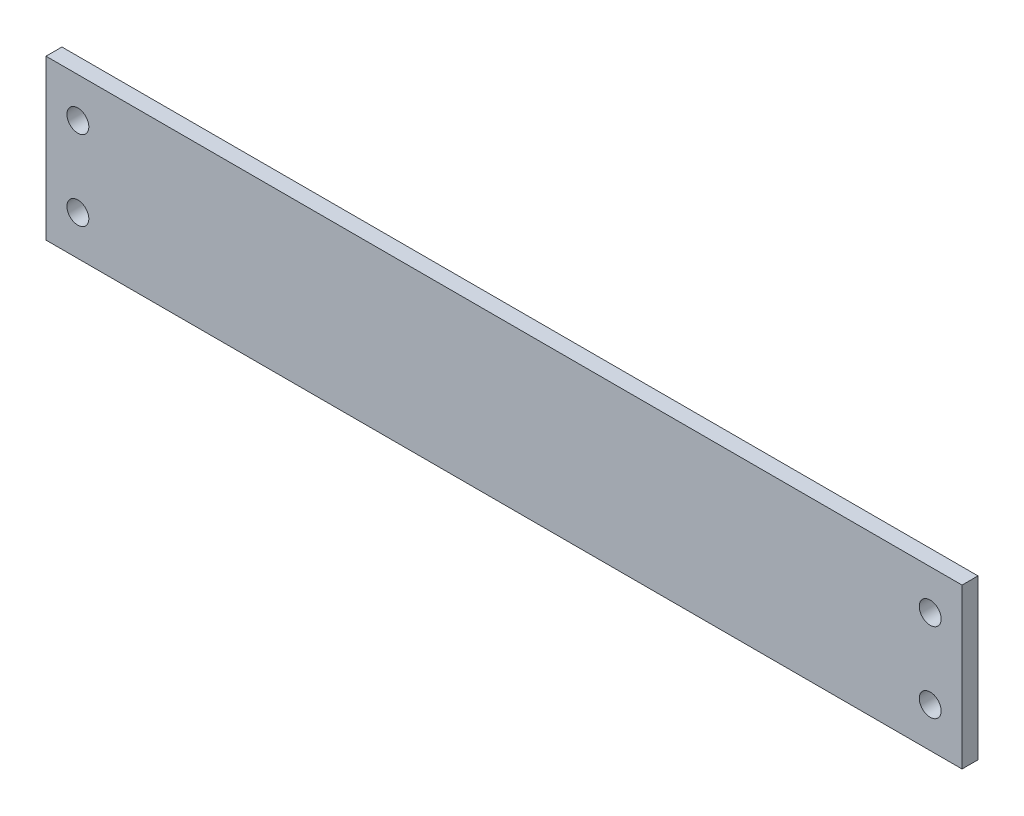
ISO-10303-21;
HEADER;
FILE_DESCRIPTION(('STEP AP214'),'2;1');
FILE_NAME('part.step','',(''),(''),'','','');
FILE_SCHEMA(('AUTOMOTIVE_DESIGN { 1 0 10303 214 1 1 1 1 }'));
ENDSEC;
DATA;
#1=APPLICATION_CONTEXT('core data for automotive mechanical design processes');
#2=APPLICATION_PROTOCOL_DEFINITION('international standard','automotive_design',2000,#1);
#3=PRODUCT_CONTEXT('',#1,'mechanical');
#4=PRODUCT('Part','Part','',(#3));
#5=PRODUCT_RELATED_PRODUCT_CATEGORY('part','',(#4));
#6=PRODUCT_DEFINITION_FORMATION('','',#4);
#7=PRODUCT_DEFINITION_CONTEXT('part definition',#1,'design');
#8=PRODUCT_DEFINITION('design','',#6,#7);
#9=PRODUCT_DEFINITION_SHAPE('','',#8);
#10=(LENGTH_UNIT() NAMED_UNIT(*) SI_UNIT(.MILLI.,.METRE.));
#11=(NAMED_UNIT(*) PLANE_ANGLE_UNIT() SI_UNIT($,.RADIAN.));
#12=(NAMED_UNIT(*) SI_UNIT($,.STERADIAN.) SOLID_ANGLE_UNIT());
#13=UNCERTAINTY_MEASURE_WITH_UNIT(LENGTH_MEASURE(1.E-05),#10,'distance_accuracy_value','');
#14=(GEOMETRIC_REPRESENTATION_CONTEXT(3) GLOBAL_UNCERTAINTY_ASSIGNED_CONTEXT((#13)) GLOBAL_UNIT_ASSIGNED_CONTEXT((#10,
#11,#12)) REPRESENTATION_CONTEXT('',''));
#15=CARTESIAN_POINT('',(0.,0.,0.));
#16=DIRECTION('',(0.,0.,1.));
#17=DIRECTION('',(1.,0.,0.));
#18=AXIS2_PLACEMENT_3D('',#15,#16,#17);
#19=CARTESIAN_POINT('',(-21.25,36.75,-4.));
#20=DIRECTION('',(0.,1.,0.));
#21=DIRECTION('',(0.,0.,1.));
#22=AXIS2_PLACEMENT_3D('',#19,#20,#21);
#23=PLANE('',#22);
#24=DIRECTION('',(-1.,0.,0.));
#25=VECTOR('',#24,1.);
#26=CARTESIAN_POINT('',(-21.25,36.75,0.));
#27=LINE('',#26,#25);
#28=CARTESIAN_POINT('',(208.75,36.75,0.));
#29=VERTEX_POINT('',#28);
#30=CARTESIAN_POINT('',(-21.25,36.75,0.));
#31=VERTEX_POINT('',#30);
#32=EDGE_CURVE('E100',#29,#31,#27,.T.);
#33=ORIENTED_EDGE('',*,*,#32,.F.);
#34=DIRECTION('',(0.,0.,1.));
#35=VECTOR('',#34,1.);
#36=CARTESIAN_POINT('',(208.75,36.75,-4.));
#37=LINE('',#36,#35);
#38=CARTESIAN_POINT('',(208.75,36.75,-4.));
#39=VERTEX_POINT('',#38);
#40=EDGE_CURVE('E11',#39,#29,#37,.T.);
#41=ORIENTED_EDGE('',*,*,#40,.F.);
#42=DIRECTION('',(-1.,0.,0.));
#43=VECTOR('',#42,1.);
#44=CARTESIAN_POINT('',(-21.25,36.75,-4.));
#45=LINE('',#44,#43);
#46=CARTESIAN_POINT('',(-21.25,36.75,-4.));
#47=VERTEX_POINT('',#46);
#48=EDGE_CURVE('E93',#39,#47,#45,.T.);
#49=ORIENTED_EDGE('',*,*,#48,.T.);
#50=DIRECTION('',(0.,0.,1.));
#51=VECTOR('',#50,1.);
#52=CARTESIAN_POINT('',(-21.25,36.75,-4.));
#53=LINE('',#52,#51);
#54=EDGE_CURVE('E38',#47,#31,#53,.T.);
#55=ORIENTED_EDGE('',*,*,#54,.T.);
#56=EDGE_LOOP('',(#33,#41,#49,#55));
#57=FACE_BOUND('',#56,.T.);
#58=ADVANCED_FACE('F35',(#57),#23,.T.);
#59=CARTESIAN_POINT('',(208.75,36.75,-4.));
#60=DIRECTION('',(1.,0.,0.));
#61=DIRECTION('',(0.,0.,-1.));
#62=AXIS2_PLACEMENT_3D('',#59,#60,#61);
#63=PLANE('',#62);
#64=DIRECTION('',(0.,1.,0.));
#65=VECTOR('',#64,1.);
#66=CARTESIAN_POINT('',(208.75,36.75,0.));
#67=LINE('',#66,#65);
#68=CARTESIAN_POINT('',(208.75,-3.25,0.));
#69=VERTEX_POINT('',#68);
#70=EDGE_CURVE('E95',#69,#29,#67,.T.);
#71=ORIENTED_EDGE('',*,*,#70,.F.);
#72=DIRECTION('',(0.,0.,1.));
#73=VECTOR('',#72,1.);
#74=CARTESIAN_POINT('',(208.75,-3.25,-4.));
#75=LINE('',#74,#73);
#76=CARTESIAN_POINT('',(208.75,-3.25,-4.));
#77=VERTEX_POINT('',#76);
#78=EDGE_CURVE('E44',#77,#69,#75,.T.);
#79=ORIENTED_EDGE('',*,*,#78,.F.);
#80=DIRECTION('',(0.,1.,0.));
#81=VECTOR('',#80,1.);
#82=CARTESIAN_POINT('',(208.75,36.75,-4.));
#83=LINE('',#82,#81);
#84=EDGE_CURVE('E90',#77,#39,#83,.T.);
#85=ORIENTED_EDGE('',*,*,#84,.T.);
#86=ORIENTED_EDGE('',*,*,#40,.T.);
#87=EDGE_LOOP('',(#71,#79,#85,#86));
#88=FACE_BOUND('',#87,.T.);
#89=ADVANCED_FACE('F111',(#88),#63,.T.);
#90=CARTESIAN_POINT('',(-21.25,-3.25,-4.));
#91=DIRECTION('',(0.,-1.,0.));
#92=DIRECTION('',(0.,0.,-1.));
#93=AXIS2_PLACEMENT_3D('',#90,#91,#92);
#94=PLANE('',#93);
#95=DIRECTION('',(1.,0.,0.));
#96=VECTOR('',#95,1.);
#97=CARTESIAN_POINT('',(-21.25,-3.25,0.));
#98=LINE('',#97,#96);
#99=CARTESIAN_POINT('',(-21.25,-3.25,0.));
#100=VERTEX_POINT('',#99);
#101=EDGE_CURVE('E85',#100,#69,#98,.T.);
#102=ORIENTED_EDGE('',*,*,#101,.F.);
#103=DIRECTION('',(0.,0.,1.));
#104=VECTOR('',#103,1.);
#105=CARTESIAN_POINT('',(-21.25,-3.25,-4.));
#106=LINE('',#105,#104);
#107=CARTESIAN_POINT('',(-21.25,-3.25,-4.));
#108=VERTEX_POINT('',#107);
#109=EDGE_CURVE('E80',#108,#100,#106,.T.);
#110=ORIENTED_EDGE('',*,*,#109,.F.);
#111=DIRECTION('',(1.,0.,0.));
#112=VECTOR('',#111,1.);
#113=CARTESIAN_POINT('',(-21.25,-3.25,-4.));
#114=LINE('',#113,#112);
#115=EDGE_CURVE('E83',#108,#77,#114,.T.);
#116=ORIENTED_EDGE('',*,*,#115,.T.);
#117=ORIENTED_EDGE('',*,*,#78,.T.);
#118=EDGE_LOOP('',(#102,#110,#116,#117));
#119=FACE_BOUND('',#118,.T.);
#120=ADVANCED_FACE('F82',(#119),#94,.T.);
#121=CARTESIAN_POINT('',(-21.25,36.75,-4.));
#122=DIRECTION('',(-1.,0.,0.));
#123=DIRECTION('',(0.,0.,1.));
#124=AXIS2_PLACEMENT_3D('',#121,#122,#123);
#125=PLANE('',#124);
#126=DIRECTION('',(0.,-1.,0.));
#127=VECTOR('',#126,1.);
#128=CARTESIAN_POINT('',(-21.25,36.75,0.));
#129=LINE('',#128,#127);
#130=EDGE_CURVE('E103',#31,#100,#129,.T.);
#131=ORIENTED_EDGE('',*,*,#130,.F.);
#132=ORIENTED_EDGE('',*,*,#54,.F.);
#133=DIRECTION('',(0.,-1.,0.));
#134=VECTOR('',#133,1.);
#135=CARTESIAN_POINT('',(-21.25,36.75,-4.));
#136=LINE('',#135,#134);
#137=EDGE_CURVE('E89',#47,#108,#136,.T.);
#138=ORIENTED_EDGE('',*,*,#137,.T.);
#139=ORIENTED_EDGE('',*,*,#109,.T.);
#140=EDGE_LOOP('',(#131,#132,#138,#139));
#141=FACE_BOUND('',#140,.T.);
#142=ADVANCED_FACE('F92',(#141),#125,.T.);
#143=CARTESIAN_POINT('',(0.,0.,-4.));
#144=DIRECTION('',(0.,0.,-1.));
#145=DIRECTION('',(-1.,0.,0.));
#146=AXIS2_PLACEMENT_3D('',#143,#144,#145);
#147=PLANE('',#146);
#148=CARTESIAN_POINT('',(200.75,26.75,-4.));
#149=DIRECTION('',(0.,0.,-1.));
#150=DIRECTION('',(-1.,0.,0.));
#151=AXIS2_PLACEMENT_3D('',#148,#149,#150);
#152=CIRCLE('',#151,2.75);
#153=CARTESIAN_POINT('',(198.,26.75,-4.));
#154=VERTEX_POINT('',#153);
#155=EDGE_CURVE('E155',#154,#154,#152,.T.);
#156=ORIENTED_EDGE('',*,*,#155,.F.);
#157=EDGE_LOOP('',(#156));
#158=FACE_BOUND('',#157,.T.);
#159=CARTESIAN_POINT('',(200.75,6.75,-4.));
#160=DIRECTION('',(0.,0.,-1.));
#161=DIRECTION('',(-1.,0.,0.));
#162=AXIS2_PLACEMENT_3D('',#159,#160,#161);
#163=CIRCLE('',#162,2.75);
#164=CARTESIAN_POINT('',(198.,6.75,-4.));
#165=VERTEX_POINT('',#164);
#166=EDGE_CURVE('E157',#165,#165,#163,.T.);
#167=ORIENTED_EDGE('',*,*,#166,.F.);
#168=EDGE_LOOP('',(#167));
#169=FACE_BOUND('',#168,.T.);
#170=CARTESIAN_POINT('',(-13.25,26.75,-4.));
#171=DIRECTION('',(0.,0.,-1.));
#172=DIRECTION('',(-1.,0.,0.));
#173=AXIS2_PLACEMENT_3D('',#170,#171,#172);
#174=CIRCLE('',#173,2.75);
#175=CARTESIAN_POINT('',(-16.,26.75,-4.));
#176=VERTEX_POINT('',#175);
#177=EDGE_CURVE('E165',#176,#176,#174,.T.);
#178=ORIENTED_EDGE('',*,*,#177,.F.);
#179=EDGE_LOOP('',(#178));
#180=FACE_BOUND('',#179,.T.);
#181=CARTESIAN_POINT('',(-13.25,6.75,-4.));
#182=DIRECTION('',(0.,0.,-1.));
#183=DIRECTION('',(-1.,0.,0.));
#184=AXIS2_PLACEMENT_3D('',#181,#182,#183);
#185=CIRCLE('',#184,2.75);
#186=CARTESIAN_POINT('',(-16.,6.75,-4.));
#187=VERTEX_POINT('',#186);
#188=EDGE_CURVE('E171',#187,#187,#185,.T.);
#189=ORIENTED_EDGE('',*,*,#188,.F.);
#190=EDGE_LOOP('',(#189));
#191=FACE_BOUND('',#190,.T.);
#192=ORIENTED_EDGE('',*,*,#48,.F.);
#193=ORIENTED_EDGE('',*,*,#84,.F.);
#194=ORIENTED_EDGE('',*,*,#115,.F.);
#195=ORIENTED_EDGE('',*,*,#137,.F.);
#196=EDGE_LOOP('',(#192,#193,#194,#195));
#197=FACE_BOUND('',#196,.T.);
#198=ADVANCED_FACE('F88',(#158,#169,#180,#191,#197),#147,.T.);
#199=CARTESIAN_POINT('',(0.,0.,0.));
#200=DIRECTION('',(0.,0.,-1.));
#201=DIRECTION('',(-1.,0.,0.));
#202=AXIS2_PLACEMENT_3D('',#199,#200,#201);
#203=PLANE('',#202);
#204=CARTESIAN_POINT('',(200.75,26.75,0.));
#205=DIRECTION('',(0.,0.,-1.));
#206=DIRECTION('',(-1.,0.,0.));
#207=AXIS2_PLACEMENT_3D('',#204,#205,#206);
#208=CIRCLE('',#207,2.75);
#209=CARTESIAN_POINT('',(198.,26.75,0.));
#210=VERTEX_POINT('',#209);
#211=EDGE_CURVE('E153',#210,#210,#208,.T.);
#212=ORIENTED_EDGE('',*,*,#211,.T.);
#213=EDGE_LOOP('',(#212));
#214=FACE_BOUND('',#213,.T.);
#215=CARTESIAN_POINT('',(200.75,6.75,0.));
#216=DIRECTION('',(0.,0.,-1.));
#217=DIRECTION('',(-1.,0.,0.));
#218=AXIS2_PLACEMENT_3D('',#215,#216,#217);
#219=CIRCLE('',#218,2.75);
#220=CARTESIAN_POINT('',(198.,6.75,0.));
#221=VERTEX_POINT('',#220);
#222=EDGE_CURVE('E162',#221,#221,#219,.T.);
#223=ORIENTED_EDGE('',*,*,#222,.T.);
#224=EDGE_LOOP('',(#223));
#225=FACE_BOUND('',#224,.T.);
#226=CARTESIAN_POINT('',(-13.25,26.75,0.));
#227=DIRECTION('',(0.,0.,-1.));
#228=DIRECTION('',(-1.,0.,0.));
#229=AXIS2_PLACEMENT_3D('',#226,#227,#228);
#230=CIRCLE('',#229,2.75);
#231=CARTESIAN_POINT('',(-16.,26.75,0.));
#232=VERTEX_POINT('',#231);
#233=EDGE_CURVE('E168',#232,#232,#230,.T.);
#234=ORIENTED_EDGE('',*,*,#233,.T.);
#235=EDGE_LOOP('',(#234));
#236=FACE_BOUND('',#235,.T.);
#237=CARTESIAN_POINT('',(-13.25,6.75,0.));
#238=DIRECTION('',(0.,0.,-1.));
#239=DIRECTION('',(-1.,0.,0.));
#240=AXIS2_PLACEMENT_3D('',#237,#238,#239);
#241=CIRCLE('',#240,2.75);
#242=CARTESIAN_POINT('',(-16.,6.75,0.));
#243=VERTEX_POINT('',#242);
#244=EDGE_CURVE('E104',#243,#243,#241,.T.);
#245=ORIENTED_EDGE('',*,*,#244,.T.);
#246=EDGE_LOOP('',(#245));
#247=FACE_BOUND('',#246,.T.);
#248=ORIENTED_EDGE('',*,*,#32,.T.);
#249=ORIENTED_EDGE('',*,*,#130,.T.);
#250=ORIENTED_EDGE('',*,*,#101,.T.);
#251=ORIENTED_EDGE('',*,*,#70,.T.);
#252=EDGE_LOOP('',(#248,#249,#250,#251));
#253=FACE_BOUND('',#252,.T.);
#254=ADVANCED_FACE('F110',(#214,#225,#236,#247,#253),#203,.F.);
#255=CARTESIAN_POINT('',(-13.25,6.75,-4.));
#256=DIRECTION('',(0.,0.,-1.));
#257=DIRECTION('',(-1.,0.,0.));
#258=AXIS2_PLACEMENT_3D('',#255,#256,#257);
#259=CYLINDRICAL_SURFACE('',#258,2.75);
#260=ORIENTED_EDGE('',*,*,#244,.F.);
#261=EDGE_LOOP('',(#260));
#262=FACE_BOUND('',#261,.T.);
#263=ORIENTED_EDGE('',*,*,#188,.T.);
#264=EDGE_LOOP('',(#263));
#265=FACE_BOUND('',#264,.T.);
#266=ADVANCED_FACE('F129',(#262,#265),#259,.F.);
#267=CARTESIAN_POINT('',(-13.25,26.75,-4.));
#268=DIRECTION('',(0.,0.,-1.));
#269=DIRECTION('',(-1.,0.,0.));
#270=AXIS2_PLACEMENT_3D('',#267,#268,#269);
#271=CYLINDRICAL_SURFACE('',#270,2.75);
#272=ORIENTED_EDGE('',*,*,#233,.F.);
#273=EDGE_LOOP('',(#272));
#274=FACE_BOUND('',#273,.T.);
#275=ORIENTED_EDGE('',*,*,#177,.T.);
#276=EDGE_LOOP('',(#275));
#277=FACE_BOUND('',#276,.T.);
#278=ADVANCED_FACE('F136',(#274,#277),#271,.F.);
#279=CARTESIAN_POINT('',(200.75,6.75,-4.));
#280=DIRECTION('',(0.,0.,-1.));
#281=DIRECTION('',(-1.,0.,0.));
#282=AXIS2_PLACEMENT_3D('',#279,#280,#281);
#283=CYLINDRICAL_SURFACE('',#282,2.75);
#284=ORIENTED_EDGE('',*,*,#222,.F.);
#285=EDGE_LOOP('',(#284));
#286=FACE_BOUND('',#285,.T.);
#287=ORIENTED_EDGE('',*,*,#166,.T.);
#288=EDGE_LOOP('',(#287));
#289=FACE_BOUND('',#288,.T.);
#290=ADVANCED_FACE('F140',(#286,#289),#283,.F.);
#291=CARTESIAN_POINT('',(200.75,26.75,-4.));
#292=DIRECTION('',(0.,0.,-1.));
#293=DIRECTION('',(-1.,0.,0.));
#294=AXIS2_PLACEMENT_3D('',#291,#292,#293);
#295=CYLINDRICAL_SURFACE('',#294,2.75);
#296=ORIENTED_EDGE('',*,*,#211,.F.);
#297=EDGE_LOOP('',(#296));
#298=FACE_BOUND('',#297,.T.);
#299=ORIENTED_EDGE('',*,*,#155,.T.);
#300=EDGE_LOOP('',(#299));
#301=FACE_BOUND('',#300,.T.);
#302=ADVANCED_FACE('F144',(#298,#301),#295,.F.);
#303=CLOSED_SHELL('',(#58,#89,#120,#142,#198,#254,#266,#278,#290,#302));
#304=MANIFOLD_SOLID_BREP('B2',#303);
#305=ADVANCED_BREP_SHAPE_REPRESENTATION('',(#18,#304),#14);
#306=SHAPE_DEFINITION_REPRESENTATION(#9,#305);
ENDSEC;
END-ISO-10303-21;
